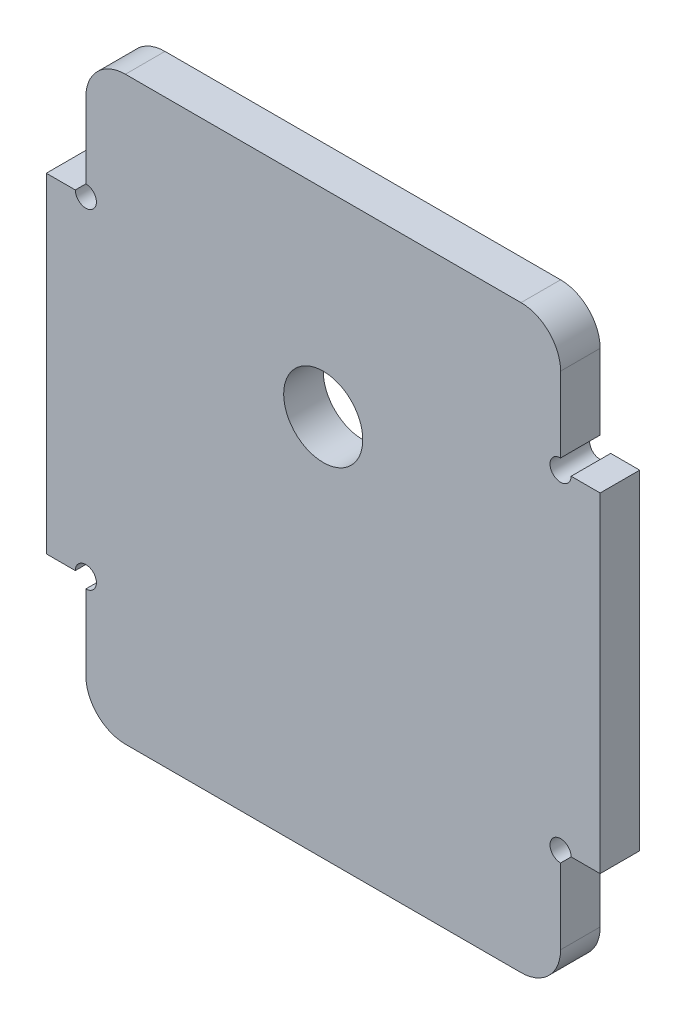
ISO-10303-21;
HEADER;
FILE_DESCRIPTION(('STEP AP214'),'2;1');
FILE_NAME('part.step','',(''),(''),'','','');
FILE_SCHEMA(('AUTOMOTIVE_DESIGN { 1 0 10303 214 1 1 1 1 }'));
ENDSEC;
DATA;
#1=APPLICATION_CONTEXT('core data for automotive mechanical design processes');
#2=APPLICATION_PROTOCOL_DEFINITION('international standard','automotive_design',2000,#1);
#3=PRODUCT_CONTEXT('',#1,'mechanical');
#4=PRODUCT('Part','Part','',(#3));
#5=PRODUCT_RELATED_PRODUCT_CATEGORY('part','',(#4));
#6=PRODUCT_DEFINITION_FORMATION('','',#4);
#7=PRODUCT_DEFINITION_CONTEXT('part definition',#1,'design');
#8=PRODUCT_DEFINITION('design','',#6,#7);
#9=PRODUCT_DEFINITION_SHAPE('','',#8);
#10=(LENGTH_UNIT() NAMED_UNIT(*) SI_UNIT(.MILLI.,.METRE.));
#11=(NAMED_UNIT(*) PLANE_ANGLE_UNIT() SI_UNIT($,.RADIAN.));
#12=(NAMED_UNIT(*) SI_UNIT($,.STERADIAN.) SOLID_ANGLE_UNIT());
#13=UNCERTAINTY_MEASURE_WITH_UNIT(LENGTH_MEASURE(1.E-05),#10,'distance_accuracy_value','');
#14=(GEOMETRIC_REPRESENTATION_CONTEXT(3) GLOBAL_UNCERTAINTY_ASSIGNED_CONTEXT((#13)) GLOBAL_UNIT_ASSIGNED_CONTEXT((#10,
#11,#12)) REPRESENTATION_CONTEXT('',''));
#15=CARTESIAN_POINT('',(0.,0.,0.));
#16=DIRECTION('',(0.,0.,1.));
#17=DIRECTION('',(1.,0.,0.));
#18=AXIS2_PLACEMENT_3D('',#15,#16,#17);
#19=CARTESIAN_POINT('',(-18.,0.,3.));
#20=DIRECTION('',(-1.,0.,0.));
#21=DIRECTION('',(0.,-1.,0.));
#22=AXIS2_PLACEMENT_3D('',#19,#20,#21);
#23=PLANE('',#22);
#24=DIRECTION('',(0.,1.,0.));
#25=VECTOR('',#24,1.);
#26=CARTESIAN_POINT('',(-18.,0.,3.));
#27=LINE('',#26,#25);
#28=CARTESIAN_POINT('',(-18.,13.3,3.));
#29=VERTEX_POINT('',#28);
#30=CARTESIAN_POINT('',(-18.,19.,3.));
#31=VERTEX_POINT('',#30);
#32=EDGE_CURVE('E216',#29,#31,#27,.T.);
#33=ORIENTED_EDGE('',*,*,#32,.T.);
#34=DIRECTION('',(0.,0.,-1.));
#35=VECTOR('',#34,1.);
#36=CARTESIAN_POINT('',(-18.,19.,3.));
#37=LINE('',#36,#35);
#38=CARTESIAN_POINT('',(-18.,19.,0.));
#39=VERTEX_POINT('',#38);
#40=EDGE_CURVE('E340',#31,#39,#37,.T.);
#41=ORIENTED_EDGE('',*,*,#40,.T.);
#42=DIRECTION('',(0.,1.,0.));
#43=VECTOR('',#42,1.);
#44=CARTESIAN_POINT('',(-18.,0.,0.));
#45=LINE('',#44,#43);
#46=CARTESIAN_POINT('',(-18.,13.3,0.));
#47=VERTEX_POINT('',#46);
#48=EDGE_CURVE('E234',#47,#39,#45,.T.);
#49=ORIENTED_EDGE('',*,*,#48,.F.);
#50=DIRECTION('',(0.,0.,-1.));
#51=VECTOR('',#50,1.);
#52=CARTESIAN_POINT('',(-18.,13.3,3.));
#53=LINE('',#52,#51);
#54=EDGE_CURVE('E231',#29,#47,#53,.T.);
#55=ORIENTED_EDGE('',*,*,#54,.F.);
#56=EDGE_LOOP('',(#33,#41,#49,#55));
#57=FACE_BOUND('',#56,.T.);
#58=ADVANCED_FACE('F35',(#57),#23,.T.);
#59=CARTESIAN_POINT('',(0.,12.5,3.));
#60=DIRECTION('',(0.,1.,0.));
#61=DIRECTION('',(0.,0.,1.));
#62=AXIS2_PLACEMENT_3D('',#59,#60,#61);
#63=PLANE('',#62);
#64=DIRECTION('',(0.,0.,-1.));
#65=VECTOR('',#64,1.);
#66=CARTESIAN_POINT('',(-18.8,12.5,3.));
#67=LINE('',#66,#65);
#68=CARTESIAN_POINT('',(-18.8,12.5,0.));
#69=VERTEX_POINT('',#68);
#70=CARTESIAN_POINT('',(-18.8,12.5,3.));
#71=VERTEX_POINT('',#70);
#72=EDGE_CURVE('E236',#69,#71,#67,.F.);
#73=ORIENTED_EDGE('',*,*,#72,.F.);
#74=DIRECTION('',(1.,0.,0.));
#75=VECTOR('',#74,1.);
#76=CARTESIAN_POINT('',(0.,12.5,0.));
#77=LINE('',#76,#75);
#78=CARTESIAN_POINT('',(-21.,12.5,0.));
#79=VERTEX_POINT('',#78);
#80=EDGE_CURVE('E281',#79,#69,#77,.T.);
#81=ORIENTED_EDGE('',*,*,#80,.F.);
#82=DIRECTION('',(0.,0.,-1.));
#83=VECTOR('',#82,1.);
#84=CARTESIAN_POINT('',(-21.,12.5,3.));
#85=LINE('',#84,#83);
#86=CARTESIAN_POINT('',(-21.,12.5,3.));
#87=VERTEX_POINT('',#86);
#88=EDGE_CURVE('E307',#87,#79,#85,.T.);
#89=ORIENTED_EDGE('',*,*,#88,.F.);
#90=DIRECTION('',(1.,0.,0.));
#91=VECTOR('',#90,1.);
#92=CARTESIAN_POINT('',(0.,12.5,3.));
#93=LINE('',#92,#91);
#94=EDGE_CURVE('E223',#87,#71,#93,.T.);
#95=ORIENTED_EDGE('',*,*,#94,.T.);
#96=EDGE_LOOP('',(#73,#81,#89,#95));
#97=FACE_BOUND('',#96,.T.);
#98=ADVANCED_FACE('F364',(#97),#63,.T.);
#99=CARTESIAN_POINT('',(-21.,0.,3.));
#100=DIRECTION('',(-1.,0.,0.));
#101=DIRECTION('',(0.,0.,1.));
#102=AXIS2_PLACEMENT_3D('',#99,#100,#101);
#103=PLANE('',#102);
#104=DIRECTION('',(0.,1.,0.));
#105=VECTOR('',#104,1.);
#106=CARTESIAN_POINT('',(-21.,0.,0.));
#107=LINE('',#106,#105);
#108=CARTESIAN_POINT('',(-21.,-12.5,0.));
#109=VERTEX_POINT('',#108);
#110=EDGE_CURVE('E285',#109,#79,#107,.T.);
#111=ORIENTED_EDGE('',*,*,#110,.F.);
#112=DIRECTION('',(0.,0.,-1.));
#113=VECTOR('',#112,1.);
#114=CARTESIAN_POINT('',(-21.,-12.5,3.));
#115=LINE('',#114,#113);
#116=CARTESIAN_POINT('',(-21.,-12.5,3.));
#117=VERTEX_POINT('',#116);
#118=EDGE_CURVE('E272',#117,#109,#115,.T.);
#119=ORIENTED_EDGE('',*,*,#118,.F.);
#120=DIRECTION('',(0.,1.,0.));
#121=VECTOR('',#120,1.);
#122=CARTESIAN_POINT('',(-21.,0.,3.));
#123=LINE('',#122,#121);
#124=EDGE_CURVE('E220',#117,#87,#123,.T.);
#125=ORIENTED_EDGE('',*,*,#124,.T.);
#126=ORIENTED_EDGE('',*,*,#88,.T.);
#127=EDGE_LOOP('',(#111,#119,#125,#126));
#128=FACE_BOUND('',#127,.T.);
#129=ADVANCED_FACE('F369',(#128),#103,.T.);
#130=CARTESIAN_POINT('',(0.,-12.5,3.));
#131=DIRECTION('',(0.,1.,0.));
#132=DIRECTION('',(0.,0.,1.));
#133=AXIS2_PLACEMENT_3D('',#130,#131,#132);
#134=PLANE('',#133);
#135=DIRECTION('',(1.,0.,0.));
#136=VECTOR('',#135,1.);
#137=CARTESIAN_POINT('',(0.,-12.5,0.));
#138=LINE('',#137,#136);
#139=CARTESIAN_POINT('',(-18.8,-12.5,0.));
#140=VERTEX_POINT('',#139);
#141=EDGE_CURVE('E288',#109,#140,#138,.T.);
#142=ORIENTED_EDGE('',*,*,#141,.T.);
#143=DIRECTION('',(0.,0.,-1.));
#144=VECTOR('',#143,1.);
#145=CARTESIAN_POINT('',(-18.8,-12.5,3.));
#146=LINE('',#145,#144);
#147=CARTESIAN_POINT('',(-18.8,-12.5,3.));
#148=VERTEX_POINT('',#147);
#149=EDGE_CURVE('E238',#140,#148,#146,.F.);
#150=ORIENTED_EDGE('',*,*,#149,.T.);
#151=DIRECTION('',(1.,0.,0.));
#152=VECTOR('',#151,1.);
#153=CARTESIAN_POINT('',(0.,-12.5,3.));
#154=LINE('',#153,#152);
#155=EDGE_CURVE('E214',#117,#148,#154,.T.);
#156=ORIENTED_EDGE('',*,*,#155,.F.);
#157=ORIENTED_EDGE('',*,*,#118,.T.);
#158=EDGE_LOOP('',(#142,#150,#156,#157));
#159=FACE_BOUND('',#158,.T.);
#160=ADVANCED_FACE('F373',(#159),#134,.F.);
#161=CARTESIAN_POINT('',(-18.,-19.,0.));
#162=VERTEX_POINT('',#161);
#163=CARTESIAN_POINT('',(-18.,-13.3,0.));
#164=VERTEX_POINT('',#163);
#165=EDGE_CURVE('E282',#162,#164,#45,.T.);
#166=ORIENTED_EDGE('',*,*,#165,.F.);
#167=DIRECTION('',(0.,0.,-1.));
#168=VECTOR('',#167,1.);
#169=CARTESIAN_POINT('',(-18.,-19.,3.));
#170=LINE('',#169,#168);
#171=CARTESIAN_POINT('',(-18.,-19.,3.));
#172=VERTEX_POINT('',#171);
#173=EDGE_CURVE('E338',#162,#172,#170,.F.);
#174=ORIENTED_EDGE('',*,*,#173,.T.);
#175=CARTESIAN_POINT('',(-18.,-13.3,3.));
#176=VERTEX_POINT('',#175);
#177=EDGE_CURVE('E211',#172,#176,#27,.T.);
#178=ORIENTED_EDGE('',*,*,#177,.T.);
#179=DIRECTION('',(0.,0.,-1.));
#180=VECTOR('',#179,1.);
#181=CARTESIAN_POINT('',(-18.,-13.3,3.));
#182=LINE('',#181,#180);
#183=EDGE_CURVE('E241',#164,#176,#182,.F.);
#184=ORIENTED_EDGE('',*,*,#183,.F.);
#185=EDGE_LOOP('',(#166,#174,#178,#184));
#186=FACE_BOUND('',#185,.T.);
#187=ADVANCED_FACE('F382',(#186),#23,.T.);
#188=CARTESIAN_POINT('',(0.,-22.,3.));
#189=DIRECTION('',(0.,1.,0.));
#190=DIRECTION('',(0.,0.,1.));
#191=AXIS2_PLACEMENT_3D('',#188,#189,#190);
#192=PLANE('',#191);
#193=DIRECTION('',(1.,0.,0.));
#194=VECTOR('',#193,1.);
#195=CARTESIAN_POINT('',(0.,-22.,0.));
#196=LINE('',#195,#194);
#197=CARTESIAN_POINT('',(-15.,-22.,0.));
#198=VERTEX_POINT('',#197);
#199=CARTESIAN_POINT('',(15.,-22.,0.));
#200=VERTEX_POINT('',#199);
#201=EDGE_CURVE('E291',#198,#200,#196,.T.);
#202=ORIENTED_EDGE('',*,*,#201,.T.);
#203=DIRECTION('',(0.,0.,-1.));
#204=VECTOR('',#203,1.);
#205=CARTESIAN_POINT('',(15.,-22.,3.));
#206=LINE('',#205,#204);
#207=CARTESIAN_POINT('',(15.,-22.,3.));
#208=VERTEX_POINT('',#207);
#209=EDGE_CURVE('E330',#200,#208,#206,.F.);
#210=ORIENTED_EDGE('',*,*,#209,.T.);
#211=DIRECTION('',(1.,0.,0.));
#212=VECTOR('',#211,1.);
#213=CARTESIAN_POINT('',(0.,-22.,3.));
#214=LINE('',#213,#212);
#215=CARTESIAN_POINT('',(-15.,-22.,3.));
#216=VERTEX_POINT('',#215);
#217=EDGE_CURVE('E206',#216,#208,#214,.T.);
#218=ORIENTED_EDGE('',*,*,#217,.F.);
#219=DIRECTION('',(0.,0.,-1.));
#220=VECTOR('',#219,1.);
#221=CARTESIAN_POINT('',(-15.,-22.,0.));
#222=LINE('',#221,#220);
#223=EDGE_CURVE('E327',#216,#198,#222,.T.);
#224=ORIENTED_EDGE('',*,*,#223,.T.);
#225=EDGE_LOOP('',(#202,#210,#218,#224));
#226=FACE_BOUND('',#225,.T.);
#227=ADVANCED_FACE('F388',(#226),#192,.F.);
#228=CARTESIAN_POINT('',(18.,0.,3.));
#229=DIRECTION('',(-1.,0.,0.));
#230=DIRECTION('',(0.,-1.,0.));
#231=AXIS2_PLACEMENT_3D('',#228,#229,#230);
#232=PLANE('',#231);
#233=DIRECTION('',(0.,1.,0.));
#234=VECTOR('',#233,1.);
#235=CARTESIAN_POINT('',(18.,0.,3.));
#236=LINE('',#235,#234);
#237=CARTESIAN_POINT('',(18.,-19.,3.));
#238=VERTEX_POINT('',#237);
#239=CARTESIAN_POINT('',(18.,-13.3,3.));
#240=VERTEX_POINT('',#239);
#241=EDGE_CURVE('E198',#238,#240,#236,.T.);
#242=ORIENTED_EDGE('',*,*,#241,.F.);
#243=DIRECTION('',(0.,0.,-1.));
#244=VECTOR('',#243,1.);
#245=CARTESIAN_POINT('',(18.,-19.,3.));
#246=LINE('',#245,#244);
#247=CARTESIAN_POINT('',(18.,-19.,0.));
#248=VERTEX_POINT('',#247);
#249=EDGE_CURVE('E316',#238,#248,#246,.T.);
#250=ORIENTED_EDGE('',*,*,#249,.T.);
#251=DIRECTION('',(0.,1.,0.));
#252=VECTOR('',#251,1.);
#253=CARTESIAN_POINT('',(18.,0.,0.));
#254=LINE('',#253,#252);
#255=CARTESIAN_POINT('',(18.,-13.3,0.));
#256=VERTEX_POINT('',#255);
#257=EDGE_CURVE('E294',#248,#256,#254,.T.);
#258=ORIENTED_EDGE('',*,*,#257,.T.);
#259=DIRECTION('',(0.,0.,-1.));
#260=VECTOR('',#259,1.);
#261=CARTESIAN_POINT('',(18.,-13.3,3.));
#262=LINE('',#261,#260);
#263=EDGE_CURVE('E244',#256,#240,#262,.F.);
#264=ORIENTED_EDGE('',*,*,#263,.T.);
#265=EDGE_LOOP('',(#242,#250,#258,#264));
#266=FACE_BOUND('',#265,.T.);
#267=ADVANCED_FACE('F395',(#266),#232,.F.);
#268=CARTESIAN_POINT('',(0.,-12.5,3.));
#269=DIRECTION('',(0.,-1.,0.));
#270=DIRECTION('',(0.,0.,-1.));
#271=AXIS2_PLACEMENT_3D('',#268,#269,#270);
#272=PLANE('',#271);
#273=DIRECTION('',(0.,0.,-1.));
#274=VECTOR('',#273,1.);
#275=CARTESIAN_POINT('',(18.8,-12.5,3.));
#276=LINE('',#275,#274);
#277=CARTESIAN_POINT('',(18.8,-12.5,0.));
#278=VERTEX_POINT('',#277);
#279=CARTESIAN_POINT('',(18.8,-12.5,3.));
#280=VERTEX_POINT('',#279);
#281=EDGE_CURVE('E247',#278,#280,#276,.F.);
#282=ORIENTED_EDGE('',*,*,#281,.F.);
#283=DIRECTION('',(-1.,0.,0.));
#284=VECTOR('',#283,1.);
#285=CARTESIAN_POINT('',(0.,-12.5,0.));
#286=LINE('',#285,#284);
#287=CARTESIAN_POINT('',(21.,-12.5,0.));
#288=VERTEX_POINT('',#287);
#289=EDGE_CURVE('E269',#288,#278,#286,.T.);
#290=ORIENTED_EDGE('',*,*,#289,.F.);
#291=DIRECTION('',(0.,0.,-1.));
#292=VECTOR('',#291,1.);
#293=CARTESIAN_POINT('',(21.,-12.5,3.));
#294=LINE('',#293,#292);
#295=CARTESIAN_POINT('',(21.,-12.5,3.));
#296=VERTEX_POINT('',#295);
#297=EDGE_CURVE('E267',#296,#288,#294,.T.);
#298=ORIENTED_EDGE('',*,*,#297,.F.);
#299=DIRECTION('',(-1.,0.,0.));
#300=VECTOR('',#299,1.);
#301=CARTESIAN_POINT('',(0.,-12.5,3.));
#302=LINE('',#301,#300);
#303=EDGE_CURVE('E205',#296,#280,#302,.T.);
#304=ORIENTED_EDGE('',*,*,#303,.T.);
#305=EDGE_LOOP('',(#282,#290,#298,#304));
#306=FACE_BOUND('',#305,.T.);
#307=ADVANCED_FACE('F264',(#306),#272,.T.);
#308=CARTESIAN_POINT('',(21.,0.,3.));
#309=DIRECTION('',(-1.,0.,0.));
#310=DIRECTION('',(0.,0.,1.));
#311=AXIS2_PLACEMENT_3D('',#308,#309,#310);
#312=PLANE('',#311);
#313=DIRECTION('',(0.,1.,0.));
#314=VECTOR('',#313,1.);
#315=CARTESIAN_POINT('',(21.,0.,0.));
#316=LINE('',#315,#314);
#317=CARTESIAN_POINT('',(21.,12.5,0.));
#318=VERTEX_POINT('',#317);
#319=EDGE_CURVE('E298',#288,#318,#316,.T.);
#320=ORIENTED_EDGE('',*,*,#319,.T.);
#321=DIRECTION('',(0.,0.,-1.));
#322=VECTOR('',#321,1.);
#323=CARTESIAN_POINT('',(21.,12.5,3.));
#324=LINE('',#323,#322);
#325=CARTESIAN_POINT('',(21.,12.5,3.));
#326=VERTEX_POINT('',#325);
#327=EDGE_CURVE('E199',#326,#318,#324,.T.);
#328=ORIENTED_EDGE('',*,*,#327,.F.);
#329=DIRECTION('',(0.,1.,0.));
#330=VECTOR('',#329,1.);
#331=CARTESIAN_POINT('',(21.,0.,3.));
#332=LINE('',#331,#330);
#333=EDGE_CURVE('E201',#296,#326,#332,.T.);
#334=ORIENTED_EDGE('',*,*,#333,.F.);
#335=ORIENTED_EDGE('',*,*,#297,.T.);
#336=EDGE_LOOP('',(#320,#328,#334,#335));
#337=FACE_BOUND('',#336,.T.);
#338=ADVANCED_FACE('F275',(#337),#312,.F.);
#339=CARTESIAN_POINT('',(0.,12.5,3.));
#340=DIRECTION('',(0.,-1.,0.));
#341=DIRECTION('',(0.,0.,-1.));
#342=AXIS2_PLACEMENT_3D('',#339,#340,#341);
#343=PLANE('',#342);
#344=DIRECTION('',(-1.,0.,0.));
#345=VECTOR('',#344,1.);
#346=CARTESIAN_POINT('',(0.,12.5,0.));
#347=LINE('',#346,#345);
#348=CARTESIAN_POINT('',(18.8,12.5,0.));
#349=VERTEX_POINT('',#348);
#350=EDGE_CURVE('E300',#318,#349,#347,.T.);
#351=ORIENTED_EDGE('',*,*,#350,.T.);
#352=DIRECTION('',(0.,0.,-1.));
#353=VECTOR('',#352,1.);
#354=CARTESIAN_POINT('',(18.8,12.5,3.));
#355=LINE('',#354,#353);
#356=CARTESIAN_POINT('',(18.8,12.5,3.));
#357=VERTEX_POINT('',#356);
#358=EDGE_CURVE('E183',#349,#357,#355,.F.);
#359=ORIENTED_EDGE('',*,*,#358,.T.);
#360=DIRECTION('',(-1.,0.,0.));
#361=VECTOR('',#360,1.);
#362=CARTESIAN_POINT('',(0.,12.5,3.));
#363=LINE('',#362,#361);
#364=EDGE_CURVE('E191',#326,#357,#363,.T.);
#365=ORIENTED_EDGE('',*,*,#364,.F.);
#366=ORIENTED_EDGE('',*,*,#327,.T.);
#367=EDGE_LOOP('',(#351,#359,#365,#366));
#368=FACE_BOUND('',#367,.T.);
#369=ADVANCED_FACE('F399',(#368),#343,.F.);
#370=CARTESIAN_POINT('',(18.,13.3,0.));
#371=VERTEX_POINT('',#370);
#372=CARTESIAN_POINT('',(18.,19.,0.));
#373=VERTEX_POINT('',#372);
#374=EDGE_CURVE('E296',#371,#373,#254,.T.);
#375=ORIENTED_EDGE('',*,*,#374,.T.);
#376=DIRECTION('',(0.,0.,-1.));
#377=VECTOR('',#376,1.);
#378=CARTESIAN_POINT('',(18.,19.,3.));
#379=LINE('',#378,#377);
#380=CARTESIAN_POINT('',(18.,19.,3.));
#381=VERTEX_POINT('',#380);
#382=EDGE_CURVE('E11',#373,#381,#379,.F.);
#383=ORIENTED_EDGE('',*,*,#382,.T.);
#384=CARTESIAN_POINT('',(18.,13.3,3.));
#385=VERTEX_POINT('',#384);
#386=EDGE_CURVE('E189',#385,#381,#236,.T.);
#387=ORIENTED_EDGE('',*,*,#386,.F.);
#388=DIRECTION('',(0.,0.,-1.));
#389=VECTOR('',#388,1.);
#390=CARTESIAN_POINT('',(18.,13.3,3.));
#391=LINE('',#390,#389);
#392=EDGE_CURVE('E172',#385,#371,#391,.T.);
#393=ORIENTED_EDGE('',*,*,#392,.T.);
#394=EDGE_LOOP('',(#375,#383,#387,#393));
#395=FACE_BOUND('',#394,.T.);
#396=ADVANCED_FACE('F194',(#395),#232,.F.);
#397=CARTESIAN_POINT('',(0.,22.,3.));
#398=DIRECTION('',(0.,1.,0.));
#399=DIRECTION('',(-1.,0.,0.));
#400=AXIS2_PLACEMENT_3D('',#397,#398,#399);
#401=PLANE('',#400);
#402=DIRECTION('',(1.,0.,0.));
#403=VECTOR('',#402,1.);
#404=CARTESIAN_POINT('',(0.,22.,0.));
#405=LINE('',#404,#403);
#406=CARTESIAN_POINT('',(-15.,22.,0.));
#407=VERTEX_POINT('',#406);
#408=CARTESIAN_POINT('',(15.,22.,0.));
#409=VERTEX_POINT('',#408);
#410=EDGE_CURVE('E226',#407,#409,#405,.T.);
#411=ORIENTED_EDGE('',*,*,#410,.F.);
#412=DIRECTION('',(0.,0.,-1.));
#413=VECTOR('',#412,1.);
#414=CARTESIAN_POINT('',(-15.,22.,3.));
#415=LINE('',#414,#413);
#416=CARTESIAN_POINT('',(-15.,22.,3.));
#417=VERTEX_POINT('',#416);
#418=EDGE_CURVE('E43',#407,#417,#415,.F.);
#419=ORIENTED_EDGE('',*,*,#418,.T.);
#420=DIRECTION('',(1.,0.,0.));
#421=VECTOR('',#420,1.);
#422=CARTESIAN_POINT('',(0.,22.,3.));
#423=LINE('',#422,#421);
#424=CARTESIAN_POINT('',(15.,22.,3.));
#425=VERTEX_POINT('',#424);
#426=EDGE_CURVE('E196',#417,#425,#423,.T.);
#427=ORIENTED_EDGE('',*,*,#426,.T.);
#428=DIRECTION('',(0.,0.,-1.));
#429=VECTOR('',#428,1.);
#430=CARTESIAN_POINT('',(15.,22.,0.));
#431=LINE('',#430,#429);
#432=EDGE_CURVE('E343',#425,#409,#431,.T.);
#433=ORIENTED_EDGE('',*,*,#432,.T.);
#434=EDGE_LOOP('',(#411,#419,#427,#433));
#435=FACE_BOUND('',#434,.T.);
#436=ADVANCED_FACE('F348',(#435),#401,.T.);
#437=CARTESIAN_POINT('',(0.,0.,3.));
#438=DIRECTION('',(0.,0.,1.));
#439=DIRECTION('',(1.,0.,0.));
#440=AXIS2_PLACEMENT_3D('',#437,#438,#439);
#441=PLANE('',#440);
#442=ORIENTED_EDGE('',*,*,#217,.T.);
#443=CARTESIAN_POINT('',(15.,-19.,3.));
#444=DIRECTION('',(0.,0.,1.));
#445=DIRECTION('',(1.,0.,0.));
#446=AXIS2_PLACEMENT_3D('',#443,#444,#445);
#447=CIRCLE('',#446,3.);
#448=EDGE_CURVE('E336',#208,#238,#447,.T.);
#449=ORIENTED_EDGE('',*,*,#448,.T.);
#450=ORIENTED_EDGE('',*,*,#241,.T.);
#451=CARTESIAN_POINT('',(18.,-12.5,3.));
#452=DIRECTION('',(0.,0.,-1.));
#453=DIRECTION('',(-1.,0.,0.));
#454=AXIS2_PLACEMENT_3D('',#451,#452,#453);
#455=CIRCLE('',#454,0.799999999999999);
#456=EDGE_CURVE('E192',#240,#280,#455,.T.);
#457=ORIENTED_EDGE('',*,*,#456,.T.);
#458=ORIENTED_EDGE('',*,*,#303,.F.);
#459=ORIENTED_EDGE('',*,*,#333,.T.);
#460=ORIENTED_EDGE('',*,*,#364,.T.);
#461=CARTESIAN_POINT('',(18.,12.5,3.));
#462=DIRECTION('',(0.,0.,-1.));
#463=DIRECTION('',(-1.,0.,0.));
#464=AXIS2_PLACEMENT_3D('',#461,#462,#463);
#465=CIRCLE('',#464,0.799999999999999);
#466=EDGE_CURVE('E175',#357,#385,#465,.T.);
#467=ORIENTED_EDGE('',*,*,#466,.T.);
#468=ORIENTED_EDGE('',*,*,#386,.T.);
#469=CARTESIAN_POINT('',(15.,19.,3.));
#470=DIRECTION('',(0.,0.,1.));
#471=DIRECTION('',(1.,0.,0.));
#472=AXIS2_PLACEMENT_3D('',#469,#470,#471);
#473=CIRCLE('',#472,3.);
#474=EDGE_CURVE('E56',#381,#425,#473,.T.);
#475=ORIENTED_EDGE('',*,*,#474,.T.);
#476=ORIENTED_EDGE('',*,*,#426,.F.);
#477=CARTESIAN_POINT('',(-15.,19.,3.));
#478=DIRECTION('',(0.,0.,1.));
#479=DIRECTION('',(1.,0.,0.));
#480=AXIS2_PLACEMENT_3D('',#477,#478,#479);
#481=CIRCLE('',#480,3.);
#482=EDGE_CURVE('E50',#417,#31,#481,.T.);
#483=ORIENTED_EDGE('',*,*,#482,.T.);
#484=ORIENTED_EDGE('',*,*,#32,.F.);
#485=CARTESIAN_POINT('',(-18.,12.5,3.));
#486=DIRECTION('',(0.,0.,-1.));
#487=DIRECTION('',(-1.,0.,0.));
#488=AXIS2_PLACEMENT_3D('',#485,#486,#487);
#489=CIRCLE('',#488,0.799999999999999);
#490=EDGE_CURVE('E250',#29,#71,#489,.T.);
#491=ORIENTED_EDGE('',*,*,#490,.T.);
#492=ORIENTED_EDGE('',*,*,#94,.F.);
#493=ORIENTED_EDGE('',*,*,#124,.F.);
#494=ORIENTED_EDGE('',*,*,#155,.T.);
#495=CARTESIAN_POINT('',(-18.,-12.5,3.));
#496=DIRECTION('',(0.,0.,-1.));
#497=DIRECTION('',(-1.,0.,0.));
#498=AXIS2_PLACEMENT_3D('',#495,#496,#497);
#499=CIRCLE('',#498,0.799999999999999);
#500=EDGE_CURVE('E256',#148,#176,#499,.T.);
#501=ORIENTED_EDGE('',*,*,#500,.T.);
#502=ORIENTED_EDGE('',*,*,#177,.F.);
#503=CARTESIAN_POINT('',(-15.,-19.,3.));
#504=DIRECTION('',(0.,0.,1.));
#505=DIRECTION('',(1.,0.,0.));
#506=AXIS2_PLACEMENT_3D('',#503,#504,#505);
#507=CIRCLE('',#506,3.);
#508=EDGE_CURVE('E334',#172,#216,#507,.T.);
#509=ORIENTED_EDGE('',*,*,#508,.T.);
#510=EDGE_LOOP('',(#442,#449,#450,#457,#458,#459,#460,#467,#468,#475,#476,#483,#484,#491,#492,
#493,#494,#501,#502,#509));
#511=FACE_BOUND('',#510,.T.);
#512=CARTESIAN_POINT('',(0.,7.00000000000001,3.));
#513=DIRECTION('',(0.,0.,-1.));
#514=DIRECTION('',(-1.,0.,0.));
#515=AXIS2_PLACEMENT_3D('',#512,#513,#514);
#516=CIRCLE('',#515,3.);
#517=CARTESIAN_POINT('',(-3.,7.00000000000001,3.));
#518=VERTEX_POINT('',#517);
#519=EDGE_CURVE('E230',#518,#518,#516,.T.);
#520=ORIENTED_EDGE('',*,*,#519,.T.);
#521=EDGE_LOOP('',(#520));
#522=FACE_BOUND('',#521,.T.);
#523=ADVANCED_FACE('F187',(#511,#522),#441,.T.);
#524=CARTESIAN_POINT('',(0.,0.,0.));
#525=DIRECTION('',(0.,0.,1.));
#526=DIRECTION('',(1.,0.,0.));
#527=AXIS2_PLACEMENT_3D('',#524,#525,#526);
#528=PLANE('',#527);
#529=CARTESIAN_POINT('',(0.,7.00000000000001,0.));
#530=DIRECTION('',(0.,0.,-1.));
#531=DIRECTION('',(-1.,0.,0.));
#532=AXIS2_PLACEMENT_3D('',#529,#530,#531);
#533=CIRCLE('',#532,3.);
#534=CARTESIAN_POINT('',(-3.,7.00000000000001,0.));
#535=VERTEX_POINT('',#534);
#536=EDGE_CURVE('E227',#535,#535,#533,.T.);
#537=ORIENTED_EDGE('',*,*,#536,.F.);
#538=EDGE_LOOP('',(#537));
#539=FACE_BOUND('',#538,.T.);
#540=ORIENTED_EDGE('',*,*,#257,.F.);
#541=CARTESIAN_POINT('',(15.,-19.,0.));
#542=DIRECTION('',(0.,0.,1.));
#543=DIRECTION('',(1.,0.,0.));
#544=AXIS2_PLACEMENT_3D('',#541,#542,#543);
#545=CIRCLE('',#544,3.);
#546=EDGE_CURVE('E325',#248,#200,#545,.F.);
#547=ORIENTED_EDGE('',*,*,#546,.T.);
#548=ORIENTED_EDGE('',*,*,#201,.F.);
#549=CARTESIAN_POINT('',(-15.,-19.,0.));
#550=DIRECTION('',(0.,0.,1.));
#551=DIRECTION('',(1.,0.,0.));
#552=AXIS2_PLACEMENT_3D('',#549,#550,#551);
#553=CIRCLE('',#552,3.);
#554=EDGE_CURVE('E323',#198,#162,#553,.F.);
#555=ORIENTED_EDGE('',*,*,#554,.T.);
#556=ORIENTED_EDGE('',*,*,#165,.T.);
#557=CARTESIAN_POINT('',(-18.,-12.5,0.));
#558=DIRECTION('',(0.,0.,-1.));
#559=DIRECTION('',(-1.,0.,0.));
#560=AXIS2_PLACEMENT_3D('',#557,#558,#559);
#561=CIRCLE('',#560,0.799999999999999);
#562=EDGE_CURVE('E253',#140,#164,#561,.T.);
#563=ORIENTED_EDGE('',*,*,#562,.F.);
#564=ORIENTED_EDGE('',*,*,#141,.F.);
#565=ORIENTED_EDGE('',*,*,#110,.T.);
#566=ORIENTED_EDGE('',*,*,#80,.T.);
#567=CARTESIAN_POINT('',(-18.,12.5,0.));
#568=DIRECTION('',(0.,0.,1.));
#569=DIRECTION('',(1.,0.,0.));
#570=AXIS2_PLACEMENT_3D('',#567,#568,#569);
#571=CIRCLE('',#570,0.799999999999999);
#572=EDGE_CURVE('E313',#69,#47,#571,.T.);
#573=ORIENTED_EDGE('',*,*,#572,.T.);
#574=ORIENTED_EDGE('',*,*,#48,.T.);
#575=CARTESIAN_POINT('',(-15.,19.,0.));
#576=DIRECTION('',(0.,0.,1.));
#577=DIRECTION('',(1.,0.,0.));
#578=AXIS2_PLACEMENT_3D('',#575,#576,#577);
#579=CIRCLE('',#578,3.);
#580=EDGE_CURVE('E321',#39,#407,#579,.F.);
#581=ORIENTED_EDGE('',*,*,#580,.T.);
#582=ORIENTED_EDGE('',*,*,#410,.T.);
#583=CARTESIAN_POINT('',(15.,19.,0.));
#584=DIRECTION('',(0.,0.,1.));
#585=DIRECTION('',(1.,0.,0.));
#586=AXIS2_PLACEMENT_3D('',#583,#584,#585);
#587=CIRCLE('',#586,3.);
#588=EDGE_CURVE('E319',#409,#373,#587,.F.);
#589=ORIENTED_EDGE('',*,*,#588,.T.);
#590=ORIENTED_EDGE('',*,*,#374,.F.);
#591=CARTESIAN_POINT('',(18.,12.5,0.));
#592=DIRECTION('',(0.,0.,1.));
#593=DIRECTION('',(1.,0.,0.));
#594=AXIS2_PLACEMENT_3D('',#591,#592,#593);
#595=CIRCLE('',#594,0.799999999999999);
#596=EDGE_CURVE('E178',#371,#349,#595,.T.);
#597=ORIENTED_EDGE('',*,*,#596,.T.);
#598=ORIENTED_EDGE('',*,*,#350,.F.);
#599=ORIENTED_EDGE('',*,*,#319,.F.);
#600=ORIENTED_EDGE('',*,*,#289,.T.);
#601=CARTESIAN_POINT('',(18.,-12.5,0.));
#602=DIRECTION('',(0.,0.,1.));
#603=DIRECTION('',(1.,0.,0.));
#604=AXIS2_PLACEMENT_3D('',#601,#602,#603);
#605=CIRCLE('',#604,0.799999999999999);
#606=EDGE_CURVE('E310',#278,#256,#605,.T.);
#607=ORIENTED_EDGE('',*,*,#606,.T.);
#608=EDGE_LOOP('',(#540,#547,#548,#555,#556,#563,#564,#565,#566,#573,#574,#581,#582,#589,#590,
#597,#598,#599,#600,#607));
#609=FACE_BOUND('',#608,.T.);
#610=ADVANCED_FACE('F358',(#539,#609),#528,.F.);
#611=CARTESIAN_POINT('',(0.,7.00000000000001,3.));
#612=DIRECTION('',(0.,0.,-1.));
#613=DIRECTION('',(-1.,0.,0.));
#614=AXIS2_PLACEMENT_3D('',#611,#612,#613);
#615=CYLINDRICAL_SURFACE('',#614,3.);
#616=ORIENTED_EDGE('',*,*,#519,.F.);
#617=EDGE_LOOP('',(#616));
#618=FACE_BOUND('',#617,.T.);
#619=ORIENTED_EDGE('',*,*,#536,.T.);
#620=EDGE_LOOP('',(#619));
#621=FACE_BOUND('',#620,.T.);
#622=ADVANCED_FACE('F477',(#618,#621),#615,.F.);
#623=CARTESIAN_POINT('',(18.,12.5,3.));
#624=DIRECTION('',(0.,0.,-1.));
#625=DIRECTION('',(-1.,0.,0.));
#626=AXIS2_PLACEMENT_3D('',#623,#624,#625);
#627=CYLINDRICAL_SURFACE('',#626,0.799999999999999);
#628=ORIENTED_EDGE('',*,*,#596,.F.);
#629=ORIENTED_EDGE('',*,*,#392,.F.);
#630=ORIENTED_EDGE('',*,*,#466,.F.);
#631=ORIENTED_EDGE('',*,*,#358,.F.);
#632=EDGE_LOOP('',(#628,#629,#630,#631));
#633=FACE_BOUND('',#632,.T.);
#634=ADVANCED_FACE('F174',(#633),#627,.F.);
#635=CARTESIAN_POINT('',(18.,-12.5,3.));
#636=DIRECTION('',(0.,0.,-1.));
#637=DIRECTION('',(-1.,0.,0.));
#638=AXIS2_PLACEMENT_3D('',#635,#636,#637);
#639=CYLINDRICAL_SURFACE('',#638,0.799999999999999);
#640=ORIENTED_EDGE('',*,*,#606,.F.);
#641=ORIENTED_EDGE('',*,*,#281,.T.);
#642=ORIENTED_EDGE('',*,*,#456,.F.);
#643=ORIENTED_EDGE('',*,*,#263,.F.);
#644=EDGE_LOOP('',(#640,#641,#642,#643));
#645=FACE_BOUND('',#644,.T.);
#646=ADVANCED_FACE('F396',(#645),#639,.F.);
#647=CARTESIAN_POINT('',(-18.,-12.5,3.));
#648=DIRECTION('',(0.,0.,-1.));
#649=DIRECTION('',(-1.,0.,0.));
#650=AXIS2_PLACEMENT_3D('',#647,#648,#649);
#651=CYLINDRICAL_SURFACE('',#650,0.799999999999999);
#652=ORIENTED_EDGE('',*,*,#562,.T.);
#653=ORIENTED_EDGE('',*,*,#183,.T.);
#654=ORIENTED_EDGE('',*,*,#500,.F.);
#655=ORIENTED_EDGE('',*,*,#149,.F.);
#656=EDGE_LOOP('',(#652,#653,#654,#655));
#657=FACE_BOUND('',#656,.T.);
#658=ADVANCED_FACE('F377',(#657),#651,.F.);
#659=CARTESIAN_POINT('',(-18.,12.5,3.));
#660=DIRECTION('',(0.,0.,-1.));
#661=DIRECTION('',(-1.,0.,0.));
#662=AXIS2_PLACEMENT_3D('',#659,#660,#661);
#663=CYLINDRICAL_SURFACE('',#662,0.799999999999999);
#664=ORIENTED_EDGE('',*,*,#54,.T.);
#665=ORIENTED_EDGE('',*,*,#572,.F.);
#666=ORIENTED_EDGE('',*,*,#72,.T.);
#667=ORIENTED_EDGE('',*,*,#490,.F.);
#668=EDGE_LOOP('',(#664,#665,#666,#667));
#669=FACE_BOUND('',#668,.T.);
#670=ADVANCED_FACE('F362',(#669),#663,.F.);
#671=CARTESIAN_POINT('',(15.,-19.,3.));
#672=DIRECTION('',(0.,0.,-1.));
#673=DIRECTION('',(-1.,0.,0.));
#674=AXIS2_PLACEMENT_3D('',#671,#672,#673);
#675=CYLINDRICAL_SURFACE('',#674,3.);
#676=ORIENTED_EDGE('',*,*,#448,.F.);
#677=ORIENTED_EDGE('',*,*,#209,.F.);
#678=ORIENTED_EDGE('',*,*,#546,.F.);
#679=ORIENTED_EDGE('',*,*,#249,.F.);
#680=EDGE_LOOP('',(#676,#677,#678,#679));
#681=FACE_BOUND('',#680,.T.);
#682=ADVANCED_FACE('F392',(#681),#675,.T.);
#683=CARTESIAN_POINT('',(-15.,-19.,3.));
#684=DIRECTION('',(0.,0.,1.));
#685=DIRECTION('',(1.,0.,0.));
#686=AXIS2_PLACEMENT_3D('',#683,#684,#685);
#687=CYLINDRICAL_SURFACE('',#686,3.);
#688=ORIENTED_EDGE('',*,*,#508,.F.);
#689=ORIENTED_EDGE('',*,*,#173,.F.);
#690=ORIENTED_EDGE('',*,*,#554,.F.);
#691=ORIENTED_EDGE('',*,*,#223,.F.);
#692=EDGE_LOOP('',(#688,#689,#690,#691));
#693=FACE_BOUND('',#692,.T.);
#694=ADVANCED_FACE('F385',(#693),#687,.T.);
#695=CARTESIAN_POINT('',(-15.,19.,3.));
#696=DIRECTION('',(0.,0.,-1.));
#697=DIRECTION('',(-1.,0.,0.));
#698=AXIS2_PLACEMENT_3D('',#695,#696,#697);
#699=CYLINDRICAL_SURFACE('',#698,3.);
#700=ORIENTED_EDGE('',*,*,#482,.F.);
#701=ORIENTED_EDGE('',*,*,#418,.F.);
#702=ORIENTED_EDGE('',*,*,#580,.F.);
#703=ORIENTED_EDGE('',*,*,#40,.F.);
#704=EDGE_LOOP('',(#700,#701,#702,#703));
#705=FACE_BOUND('',#704,.T.);
#706=ADVANCED_FACE('F352',(#705),#699,.T.);
#707=CARTESIAN_POINT('',(15.,19.,3.));
#708=DIRECTION('',(0.,0.,1.));
#709=DIRECTION('',(1.,0.,0.));
#710=AXIS2_PLACEMENT_3D('',#707,#708,#709);
#711=CYLINDRICAL_SURFACE('',#710,3.);
#712=ORIENTED_EDGE('',*,*,#474,.F.);
#713=ORIENTED_EDGE('',*,*,#382,.F.);
#714=ORIENTED_EDGE('',*,*,#588,.F.);
#715=ORIENTED_EDGE('',*,*,#432,.F.);
#716=EDGE_LOOP('',(#712,#713,#714,#715));
#717=FACE_BOUND('',#716,.T.);
#718=ADVANCED_FACE('F37',(#717),#711,.T.);
#719=CLOSED_SHELL('',(#58,#98,#129,#160,#187,#227,#267,#307,#338,#369,#396,#436,#523,#610,#622,
#634,#646,#658,#670,#682,#694,#706,#718));
#720=MANIFOLD_SOLID_BREP('B2',#719);
#721=ADVANCED_BREP_SHAPE_REPRESENTATION('',(#18,#720),#14);
#722=SHAPE_DEFINITION_REPRESENTATION(#9,#721);
ENDSEC;
END-ISO-10303-21;
